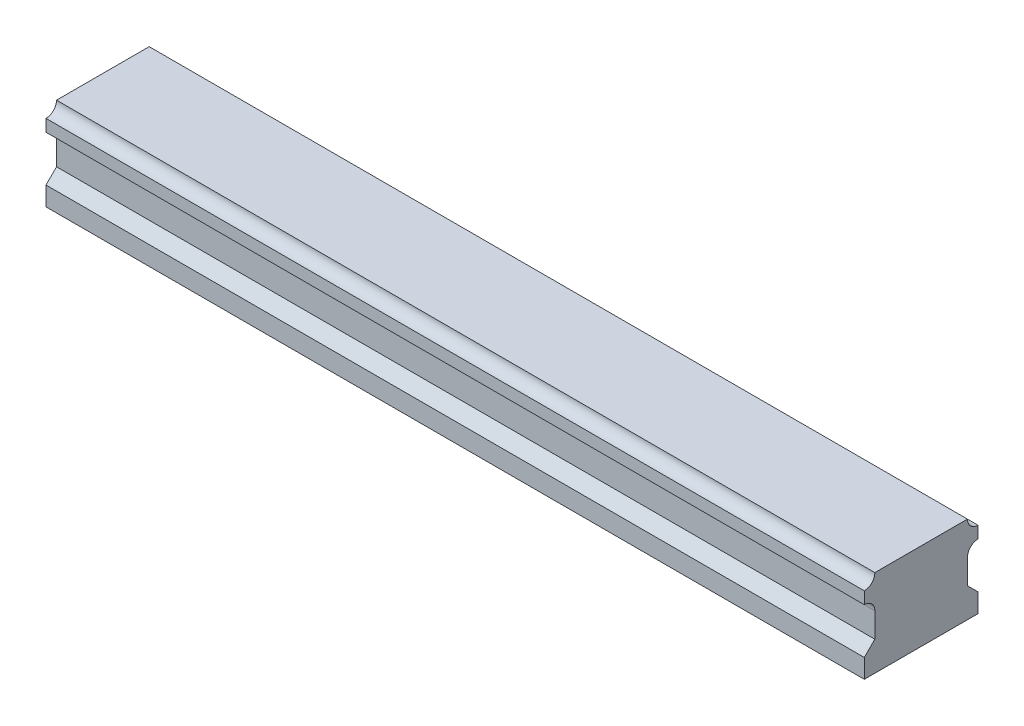
ISO-10303-21;
HEADER;
FILE_DESCRIPTION(('STEP AP214'),'2;1');
FILE_NAME('part.step','',(''),(''),'','','');
FILE_SCHEMA(('AUTOMOTIVE_DESIGN { 1 0 10303 214 1 1 1 1 }'));
ENDSEC;
DATA;
#1=APPLICATION_CONTEXT('core data for automotive mechanical design processes');
#2=APPLICATION_PROTOCOL_DEFINITION('international standard','automotive_design',2000,#1);
#3=PRODUCT_CONTEXT('',#1,'mechanical');
#4=PRODUCT('Part','Part','',(#3));
#5=PRODUCT_RELATED_PRODUCT_CATEGORY('part','',(#4));
#6=PRODUCT_DEFINITION_FORMATION('','',#4);
#7=PRODUCT_DEFINITION_CONTEXT('part definition',#1,'design');
#8=PRODUCT_DEFINITION('design','',#6,#7);
#9=PRODUCT_DEFINITION_SHAPE('','',#8);
#10=(LENGTH_UNIT() NAMED_UNIT(*) SI_UNIT(.MILLI.,.METRE.));
#11=(NAMED_UNIT(*) PLANE_ANGLE_UNIT() SI_UNIT($,.RADIAN.));
#12=(NAMED_UNIT(*) SI_UNIT($,.STERADIAN.) SOLID_ANGLE_UNIT());
#13=UNCERTAINTY_MEASURE_WITH_UNIT(LENGTH_MEASURE(1.E-05),#10,'distance_accuracy_value','');
#14=(GEOMETRIC_REPRESENTATION_CONTEXT(3) GLOBAL_UNCERTAINTY_ASSIGNED_CONTEXT((#13)) GLOBAL_UNIT_ASSIGNED_CONTEXT((#10,
#11,#12)) REPRESENTATION_CONTEXT('',''));
#15=CARTESIAN_POINT('',(0.,0.,0.));
#16=DIRECTION('',(0.,0.,1.));
#17=DIRECTION('',(1.,0.,0.));
#18=AXIS2_PLACEMENT_3D('',#15,#16,#17);
#19=CARTESIAN_POINT('',(215.9,0.,0.));
#20=DIRECTION('',(0.,0.,-1.));
#21=DIRECTION('',(-1.,0.,0.));
#22=AXIS2_PLACEMENT_3D('',#19,#20,#21);
#23=PLANE('',#22);
#24=DIRECTION('',(0.,-1.,0.));
#25=VECTOR('',#24,1.);
#26=CARTESIAN_POINT('',(0.,0.,0.));
#27=LINE('',#26,#25);
#28=CARTESIAN_POINT('',(0.,5.,0.));
#29=VERTEX_POINT('',#28);
#30=CARTESIAN_POINT('',(0.,0.,0.));
#31=VERTEX_POINT('',#30);
#32=EDGE_CURVE('E165',#29,#31,#27,.T.);
#33=ORIENTED_EDGE('',*,*,#32,.T.);
#34=DIRECTION('',(-1.,0.,0.));
#35=VECTOR('',#34,1.);
#36=CARTESIAN_POINT('',(215.9,0.,0.));
#37=LINE('',#36,#35);
#38=CARTESIAN_POINT('',(215.9,0.,0.));
#39=VERTEX_POINT('',#38);
#40=EDGE_CURVE('E11',#39,#31,#37,.T.);
#41=ORIENTED_EDGE('',*,*,#40,.F.);
#42=DIRECTION('',(0.,-1.,0.));
#43=VECTOR('',#42,1.);
#44=CARTESIAN_POINT('',(215.9,0.,0.));
#45=LINE('',#44,#43);
#46=CARTESIAN_POINT('',(215.9,5.,0.));
#47=VERTEX_POINT('',#46);
#48=EDGE_CURVE('E191',#47,#39,#45,.T.);
#49=ORIENTED_EDGE('',*,*,#48,.F.);
#50=DIRECTION('',(-1.,0.,0.));
#51=VECTOR('',#50,1.);
#52=CARTESIAN_POINT('',(215.9,5.,0.));
#53=LINE('',#52,#51);
#54=EDGE_CURVE('E161',#47,#29,#53,.T.);
#55=ORIENTED_EDGE('',*,*,#54,.T.);
#56=EDGE_LOOP('',(#33,#41,#49,#55));
#57=FACE_BOUND('',#56,.T.);
#58=ADVANCED_FACE('F33',(#57),#23,.F.);
#59=CARTESIAN_POINT('',(215.9,0.,0.));
#60=DIRECTION('',(0.,1.,0.));
#61=DIRECTION('',(0.,0.,1.));
#62=AXIS2_PLACEMENT_3D('',#59,#60,#61);
#63=PLANE('',#62);
#64=DIRECTION('',(0.,0.,-1.));
#65=VECTOR('',#64,1.);
#66=CARTESIAN_POINT('',(0.,0.,0.));
#67=LINE('',#66,#65);
#68=CARTESIAN_POINT('',(0.,0.,-30.));
#69=VERTEX_POINT('',#68);
#70=EDGE_CURVE('E168',#31,#69,#67,.T.);
#71=ORIENTED_EDGE('',*,*,#70,.T.);
#72=DIRECTION('',(-1.,0.,0.));
#73=VECTOR('',#72,1.);
#74=CARTESIAN_POINT('',(215.9,0.,-30.));
#75=LINE('',#74,#73);
#76=CARTESIAN_POINT('',(215.9,0.,-30.));
#77=VERTEX_POINT('',#76);
#78=EDGE_CURVE('E41',#77,#69,#75,.T.);
#79=ORIENTED_EDGE('',*,*,#78,.F.);
#80=DIRECTION('',(0.,0.,-1.));
#81=VECTOR('',#80,1.);
#82=CARTESIAN_POINT('',(215.9,0.,0.));
#83=LINE('',#82,#81);
#84=EDGE_CURVE('E110',#39,#77,#83,.T.);
#85=ORIENTED_EDGE('',*,*,#84,.F.);
#86=ORIENTED_EDGE('',*,*,#40,.T.);
#87=EDGE_LOOP('',(#71,#79,#85,#86));
#88=FACE_BOUND('',#87,.T.);
#89=ADVANCED_FACE('F279',(#88),#63,.F.);
#90=CARTESIAN_POINT('',(215.9,0.,-30.));
#91=DIRECTION('',(0.,0.,1.));
#92=DIRECTION('',(1.,0.,0.));
#93=AXIS2_PLACEMENT_3D('',#90,#91,#92);
#94=PLANE('',#93);
#95=DIRECTION('',(0.,1.,0.));
#96=VECTOR('',#95,1.);
#97=CARTESIAN_POINT('',(0.,0.,-30.));
#98=LINE('',#97,#96);
#99=CARTESIAN_POINT('',(0.,5.,-30.));
#100=VERTEX_POINT('',#99);
#101=EDGE_CURVE('E170',#69,#100,#98,.T.);
#102=ORIENTED_EDGE('',*,*,#101,.T.);
#103=DIRECTION('',(-1.,0.,0.));
#104=VECTOR('',#103,1.);
#105=CARTESIAN_POINT('',(215.9,5.,-30.));
#106=LINE('',#105,#104);
#107=CARTESIAN_POINT('',(215.9,5.,-30.));
#108=VERTEX_POINT('',#107);
#109=EDGE_CURVE('E216',#108,#100,#106,.T.);
#110=ORIENTED_EDGE('',*,*,#109,.F.);
#111=DIRECTION('',(0.,1.,0.));
#112=VECTOR('',#111,1.);
#113=CARTESIAN_POINT('',(215.9,0.,-30.));
#114=LINE('',#113,#112);
#115=EDGE_CURVE('E224',#77,#108,#114,.T.);
#116=ORIENTED_EDGE('',*,*,#115,.F.);
#117=ORIENTED_EDGE('',*,*,#78,.T.);
#118=EDGE_LOOP('',(#102,#110,#116,#117));
#119=FACE_BOUND('',#118,.T.);
#120=ADVANCED_FACE('F222',(#119),#94,.F.);
#121=CARTESIAN_POINT('',(215.9,5.,-30.));
#122=DIRECTION('',(0.,-0.707106781186549,0.707106781186547));
#123=DIRECTION('',(0.,-0.707106781186547,-0.707106781186549));
#124=AXIS2_PLACEMENT_3D('',#121,#122,#123);
#125=PLANE('',#124);
#126=DIRECTION('',(0.,0.707106781186546,0.707106781186548));
#127=VECTOR('',#126,1.);
#128=CARTESIAN_POINT('',(0.,5.,-30.));
#129=LINE('',#128,#127);
#130=CARTESIAN_POINT('',(0.,7.77812499999999,-27.221875));
#131=VERTEX_POINT('',#130);
#132=EDGE_CURVE('E172',#100,#131,#129,.T.);
#133=ORIENTED_EDGE('',*,*,#132,.T.);
#134=DIRECTION('',(-1.,0.,0.));
#135=VECTOR('',#134,1.);
#136=CARTESIAN_POINT('',(215.9,7.77812499999999,-27.221875));
#137=LINE('',#136,#135);
#138=CARTESIAN_POINT('',(215.9,7.77812499999999,-27.221875));
#139=VERTEX_POINT('',#138);
#140=EDGE_CURVE('E213',#139,#131,#137,.T.);
#141=ORIENTED_EDGE('',*,*,#140,.F.);
#142=DIRECTION('',(0.,0.707106781186546,0.707106781186548));
#143=VECTOR('',#142,1.);
#144=CARTESIAN_POINT('',(215.9,5.,-30.));
#145=LINE('',#144,#143);
#146=EDGE_CURVE('E242',#108,#139,#145,.T.);
#147=ORIENTED_EDGE('',*,*,#146,.F.);
#148=ORIENTED_EDGE('',*,*,#109,.T.);
#149=EDGE_LOOP('',(#133,#141,#147,#148));
#150=FACE_BOUND('',#149,.T.);
#151=ADVANCED_FACE('F233',(#150),#125,.F.);
#152=CARTESIAN_POINT('',(215.9,7.77812499999999,-27.221875));
#153=DIRECTION('',(0.,0.,1.));
#154=DIRECTION('',(0.,-1.,0.));
#155=AXIS2_PLACEMENT_3D('',#152,#153,#154);
#156=PLANE('',#155);
#157=DIRECTION('',(0.,1.,0.));
#158=VECTOR('',#157,1.);
#159=CARTESIAN_POINT('',(0.,7.77812499999999,-27.221875));
#160=LINE('',#159,#158);
#161=CARTESIAN_POINT('',(0.,14.278125,-27.221875));
#162=VERTEX_POINT('',#161);
#163=EDGE_CURVE('E174',#131,#162,#160,.T.);
#164=ORIENTED_EDGE('',*,*,#163,.T.);
#165=DIRECTION('',(-1.,0.,0.));
#166=VECTOR('',#165,1.);
#167=CARTESIAN_POINT('',(215.9,14.278125,-27.221875));
#168=LINE('',#167,#166);
#169=CARTESIAN_POINT('',(215.9,14.278125,-27.221875));
#170=VERTEX_POINT('',#169);
#171=EDGE_CURVE('E210',#170,#162,#168,.T.);
#172=ORIENTED_EDGE('',*,*,#171,.F.);
#173=DIRECTION('',(0.,1.,0.));
#174=VECTOR('',#173,1.);
#175=CARTESIAN_POINT('',(215.9,7.77812499999999,-27.221875));
#176=LINE('',#175,#174);
#177=EDGE_CURVE('E239',#139,#170,#176,.T.);
#178=ORIENTED_EDGE('',*,*,#177,.F.);
#179=ORIENTED_EDGE('',*,*,#140,.T.);
#180=EDGE_LOOP('',(#164,#172,#178,#179));
#181=FACE_BOUND('',#180,.T.);
#182=ADVANCED_FACE('F237',(#181),#156,.F.);
#183=CARTESIAN_POINT('',(215.9,14.278125,-30.));
#184=DIRECTION('',(-1.,0.,0.));
#185=DIRECTION('',(0.,0.,1.));
#186=AXIS2_PLACEMENT_3D('',#183,#184,#185);
#187=CYLINDRICAL_SURFACE('',#186,2.778125);
#188=CARTESIAN_POINT('',(0.,14.278125,-30.));
#189=DIRECTION('',(-1.,0.,0.));
#190=DIRECTION('',(0.,0.,1.));
#191=AXIS2_PLACEMENT_3D('',#188,#189,#190);
#192=CIRCLE('',#191,2.778125);
#193=CARTESIAN_POINT('',(0.,17.05625,-30.));
#194=VERTEX_POINT('',#193);
#195=EDGE_CURVE('E176',#162,#194,#192,.T.);
#196=ORIENTED_EDGE('',*,*,#195,.T.);
#197=DIRECTION('',(-1.,0.,0.));
#198=VECTOR('',#197,1.);
#199=CARTESIAN_POINT('',(215.9,17.05625,-30.));
#200=LINE('',#199,#198);
#201=CARTESIAN_POINT('',(215.9,17.05625,-30.));
#202=VERTEX_POINT('',#201);
#203=EDGE_CURVE('E207',#202,#194,#200,.T.);
#204=ORIENTED_EDGE('',*,*,#203,.F.);
#205=CARTESIAN_POINT('',(215.9,14.278125,-30.));
#206=DIRECTION('',(-1.,0.,0.));
#207=DIRECTION('',(0.,0.,1.));
#208=AXIS2_PLACEMENT_3D('',#205,#206,#207);
#209=CIRCLE('',#208,2.778125);
#210=EDGE_CURVE('E241',#170,#202,#209,.T.);
#211=ORIENTED_EDGE('',*,*,#210,.F.);
#212=ORIENTED_EDGE('',*,*,#171,.T.);
#213=EDGE_LOOP('',(#196,#204,#211,#212));
#214=FACE_BOUND('',#213,.T.);
#215=ADVANCED_FACE('F292',(#214),#187,.F.);
#216=CARTESIAN_POINT('',(215.9,20.221875,-30.));
#217=DIRECTION('',(0.,0.,1.));
#218=DIRECTION('',(1.,0.,0.));
#219=AXIS2_PLACEMENT_3D('',#216,#217,#218);
#220=PLANE('',#219);
#221=DIRECTION('',(0.,1.,0.));
#222=VECTOR('',#221,1.);
#223=CARTESIAN_POINT('',(0.,20.221875,-30.));
#224=LINE('',#223,#222);
#225=CARTESIAN_POINT('',(0.,20.221875,-30.));
#226=VERTEX_POINT('',#225);
#227=EDGE_CURVE('E178',#194,#226,#224,.T.);
#228=ORIENTED_EDGE('',*,*,#227,.T.);
#229=DIRECTION('',(-1.,0.,0.));
#230=VECTOR('',#229,1.);
#231=CARTESIAN_POINT('',(215.9,20.221875,-30.));
#232=LINE('',#231,#230);
#233=CARTESIAN_POINT('',(215.9,20.221875,-30.));
#234=VERTEX_POINT('',#233);
#235=EDGE_CURVE('E204',#234,#226,#232,.T.);
#236=ORIENTED_EDGE('',*,*,#235,.F.);
#237=DIRECTION('',(0.,1.,0.));
#238=VECTOR('',#237,1.);
#239=CARTESIAN_POINT('',(215.9,20.221875,-30.));
#240=LINE('',#239,#238);
#241=EDGE_CURVE('E244',#202,#234,#240,.T.);
#242=ORIENTED_EDGE('',*,*,#241,.F.);
#243=ORIENTED_EDGE('',*,*,#203,.T.);
#244=EDGE_LOOP('',(#228,#236,#242,#243));
#245=FACE_BOUND('',#244,.T.);
#246=ADVANCED_FACE('F295',(#245),#220,.F.);
#247=CARTESIAN_POINT('',(215.9,23.,-30.));
#248=DIRECTION('',(-1.,0.,0.));
#249=DIRECTION('',(0.,0.,1.));
#250=AXIS2_PLACEMENT_3D('',#247,#248,#249);
#251=CYLINDRICAL_SURFACE('',#250,2.778125);
#252=CARTESIAN_POINT('',(0.,23.,-30.));
#253=DIRECTION('',(-1.,0.,0.));
#254=DIRECTION('',(0.,0.,1.));
#255=AXIS2_PLACEMENT_3D('',#252,#253,#254);
#256=CIRCLE('',#255,2.778125);
#257=CARTESIAN_POINT('',(0.,23.,-27.221875));
#258=VERTEX_POINT('',#257);
#259=EDGE_CURVE('E180',#226,#258,#256,.T.);
#260=ORIENTED_EDGE('',*,*,#259,.T.);
#261=DIRECTION('',(-1.,0.,0.));
#262=VECTOR('',#261,1.);
#263=CARTESIAN_POINT('',(215.9,23.,-27.221875));
#264=LINE('',#263,#262);
#265=CARTESIAN_POINT('',(215.9,23.,-27.221875));
#266=VERTEX_POINT('',#265);
#267=EDGE_CURVE('E201',#266,#258,#264,.T.);
#268=ORIENTED_EDGE('',*,*,#267,.F.);
#269=CARTESIAN_POINT('',(215.9,23.,-30.));
#270=DIRECTION('',(-1.,0.,0.));
#271=DIRECTION('',(0.,0.,1.));
#272=AXIS2_PLACEMENT_3D('',#269,#270,#271);
#273=CIRCLE('',#272,2.778125);
#274=EDGE_CURVE('E250',#234,#266,#273,.T.);
#275=ORIENTED_EDGE('',*,*,#274,.F.);
#276=ORIENTED_EDGE('',*,*,#235,.T.);
#277=EDGE_LOOP('',(#260,#268,#275,#276));
#278=FACE_BOUND('',#277,.T.);
#279=ADVANCED_FACE('F299',(#278),#251,.F.);
#280=CARTESIAN_POINT('',(215.9,23.,-27.221875));
#281=DIRECTION('',(0.,-1.,0.));
#282=DIRECTION('',(0.,0.,-1.));
#283=AXIS2_PLACEMENT_3D('',#280,#281,#282);
#284=PLANE('',#283);
#285=DIRECTION('',(0.,0.,1.));
#286=VECTOR('',#285,1.);
#287=CARTESIAN_POINT('',(0.,23.,-27.221875));
#288=LINE('',#287,#286);
#289=CARTESIAN_POINT('',(0.,23.,-2.778125));
#290=VERTEX_POINT('',#289);
#291=EDGE_CURVE('E182',#258,#290,#288,.T.);
#292=ORIENTED_EDGE('',*,*,#291,.T.);
#293=DIRECTION('',(-1.,0.,0.));
#294=VECTOR('',#293,1.);
#295=CARTESIAN_POINT('',(215.9,23.,-2.778125));
#296=LINE('',#295,#294);
#297=CARTESIAN_POINT('',(215.9,23.,-2.778125));
#298=VERTEX_POINT('',#297);
#299=EDGE_CURVE('E198',#298,#290,#296,.T.);
#300=ORIENTED_EDGE('',*,*,#299,.F.);
#301=DIRECTION('',(0.,0.,1.));
#302=VECTOR('',#301,1.);
#303=CARTESIAN_POINT('',(215.9,23.,-27.221875));
#304=LINE('',#303,#302);
#305=EDGE_CURVE('E252',#266,#298,#304,.T.);
#306=ORIENTED_EDGE('',*,*,#305,.F.);
#307=ORIENTED_EDGE('',*,*,#267,.T.);
#308=EDGE_LOOP('',(#292,#300,#306,#307));
#309=FACE_BOUND('',#308,.T.);
#310=ADVANCED_FACE('F303',(#309),#284,.F.);
#311=CARTESIAN_POINT('',(215.9,23.,0.));
#312=DIRECTION('',(-1.,0.,0.));
#313=DIRECTION('',(0.,0.,1.));
#314=AXIS2_PLACEMENT_3D('',#311,#312,#313);
#315=CYLINDRICAL_SURFACE('',#314,2.778125);
#316=CARTESIAN_POINT('',(0.,23.,0.));
#317=DIRECTION('',(-1.,0.,0.));
#318=DIRECTION('',(0.,0.,-1.));
#319=AXIS2_PLACEMENT_3D('',#316,#317,#318);
#320=CIRCLE('',#319,2.778125);
#321=CARTESIAN_POINT('',(0.,20.221875,0.));
#322=VERTEX_POINT('',#321);
#323=EDGE_CURVE('E184',#290,#322,#320,.T.);
#324=ORIENTED_EDGE('',*,*,#323,.T.);
#325=DIRECTION('',(-1.,0.,0.));
#326=VECTOR('',#325,1.);
#327=CARTESIAN_POINT('',(215.9,20.221875,0.));
#328=LINE('',#327,#326);
#329=CARTESIAN_POINT('',(215.9,20.221875,0.));
#330=VERTEX_POINT('',#329);
#331=EDGE_CURVE('E195',#330,#322,#328,.T.);
#332=ORIENTED_EDGE('',*,*,#331,.F.);
#333=CARTESIAN_POINT('',(215.9,23.,0.));
#334=DIRECTION('',(-1.,0.,0.));
#335=DIRECTION('',(0.,0.,-1.));
#336=AXIS2_PLACEMENT_3D('',#333,#334,#335);
#337=CIRCLE('',#336,2.778125);
#338=EDGE_CURVE('E254',#298,#330,#337,.T.);
#339=ORIENTED_EDGE('',*,*,#338,.F.);
#340=ORIENTED_EDGE('',*,*,#299,.T.);
#341=EDGE_LOOP('',(#324,#332,#339,#340));
#342=FACE_BOUND('',#341,.T.);
#343=ADVANCED_FACE('F260',(#342),#315,.F.);
#344=CARTESIAN_POINT('',(215.9,20.221875,0.));
#345=DIRECTION('',(0.,0.,-1.));
#346=DIRECTION('',(0.,1.,0.));
#347=AXIS2_PLACEMENT_3D('',#344,#345,#346);
#348=PLANE('',#347);
#349=DIRECTION('',(0.,-1.,0.));
#350=VECTOR('',#349,1.);
#351=CARTESIAN_POINT('',(0.,20.221875,0.));
#352=LINE('',#351,#350);
#353=CARTESIAN_POINT('',(0.,17.05625,0.));
#354=VERTEX_POINT('',#353);
#355=EDGE_CURVE('E186',#322,#354,#352,.T.);
#356=ORIENTED_EDGE('',*,*,#355,.T.);
#357=DIRECTION('',(-1.,0.,0.));
#358=VECTOR('',#357,1.);
#359=CARTESIAN_POINT('',(215.9,17.05625,0.));
#360=LINE('',#359,#358);
#361=CARTESIAN_POINT('',(215.9,17.05625,0.));
#362=VERTEX_POINT('',#361);
#363=EDGE_CURVE('E156',#362,#354,#360,.T.);
#364=ORIENTED_EDGE('',*,*,#363,.F.);
#365=DIRECTION('',(0.,-1.,0.));
#366=VECTOR('',#365,1.);
#367=CARTESIAN_POINT('',(215.9,20.221875,0.));
#368=LINE('',#367,#366);
#369=EDGE_CURVE('E147',#330,#362,#368,.T.);
#370=ORIENTED_EDGE('',*,*,#369,.F.);
#371=ORIENTED_EDGE('',*,*,#331,.T.);
#372=EDGE_LOOP('',(#356,#364,#370,#371));
#373=FACE_BOUND('',#372,.T.);
#374=ADVANCED_FACE('F264',(#373),#348,.F.);
#375=CARTESIAN_POINT('',(215.9,14.278125,0.));
#376=DIRECTION('',(-1.,0.,0.));
#377=DIRECTION('',(0.,0.,1.));
#378=AXIS2_PLACEMENT_3D('',#375,#376,#377);
#379=CYLINDRICAL_SURFACE('',#378,2.778125);
#380=CARTESIAN_POINT('',(0.,14.278125,0.));
#381=DIRECTION('',(-1.,0.,0.));
#382=DIRECTION('',(0.,0.,-1.));
#383=AXIS2_PLACEMENT_3D('',#380,#381,#382);
#384=CIRCLE('',#383,2.778125);
#385=CARTESIAN_POINT('',(0.,14.278125,-2.778125));
#386=VERTEX_POINT('',#385);
#387=EDGE_CURVE('E155',#354,#386,#384,.T.);
#388=ORIENTED_EDGE('',*,*,#387,.T.);
#389=DIRECTION('',(-1.,0.,0.));
#390=VECTOR('',#389,1.);
#391=CARTESIAN_POINT('',(215.9,14.278125,-2.778125));
#392=LINE('',#391,#390);
#393=CARTESIAN_POINT('',(215.9,14.278125,-2.778125));
#394=VERTEX_POINT('',#393);
#395=EDGE_CURVE('E152',#394,#386,#392,.T.);
#396=ORIENTED_EDGE('',*,*,#395,.F.);
#397=CARTESIAN_POINT('',(215.9,14.278125,0.));
#398=DIRECTION('',(-1.,0.,0.));
#399=DIRECTION('',(0.,0.,-1.));
#400=AXIS2_PLACEMENT_3D('',#397,#398,#399);
#401=CIRCLE('',#400,2.778125);
#402=EDGE_CURVE('E141',#362,#394,#401,.T.);
#403=ORIENTED_EDGE('',*,*,#402,.F.);
#404=ORIENTED_EDGE('',*,*,#363,.T.);
#405=EDGE_LOOP('',(#388,#396,#403,#404));
#406=FACE_BOUND('',#405,.T.);
#407=ADVANCED_FACE('F153',(#406),#379,.F.);
#408=CARTESIAN_POINT('',(215.9,7.77812499999999,-2.778125));
#409=DIRECTION('',(0.,0.,-1.));
#410=DIRECTION('',(0.,1.,0.));
#411=AXIS2_PLACEMENT_3D('',#408,#409,#410);
#412=PLANE('',#411);
#413=DIRECTION('',(0.,-1.,0.));
#414=VECTOR('',#413,1.);
#415=CARTESIAN_POINT('',(0.,7.77812499999999,-2.778125));
#416=LINE('',#415,#414);
#417=CARTESIAN_POINT('',(0.,7.77812499999999,-2.778125));
#418=VERTEX_POINT('',#417);
#419=EDGE_CURVE('E96',#386,#418,#416,.T.);
#420=ORIENTED_EDGE('',*,*,#419,.T.);
#421=DIRECTION('',(-1.,0.,0.));
#422=VECTOR('',#421,1.);
#423=CARTESIAN_POINT('',(215.9,7.77812499999999,-2.778125));
#424=LINE('',#423,#422);
#425=CARTESIAN_POINT('',(215.9,7.77812499999999,-2.778125));
#426=VERTEX_POINT('',#425);
#427=EDGE_CURVE('E157',#426,#418,#424,.T.);
#428=ORIENTED_EDGE('',*,*,#427,.F.);
#429=DIRECTION('',(0.,-1.,0.));
#430=VECTOR('',#429,1.);
#431=CARTESIAN_POINT('',(215.9,7.77812499999999,-2.778125));
#432=LINE('',#431,#430);
#433=EDGE_CURVE('E145',#394,#426,#432,.T.);
#434=ORIENTED_EDGE('',*,*,#433,.F.);
#435=ORIENTED_EDGE('',*,*,#395,.T.);
#436=EDGE_LOOP('',(#420,#428,#434,#435));
#437=FACE_BOUND('',#436,.T.);
#438=ADVANCED_FACE('F159',(#437),#412,.F.);
#439=CARTESIAN_POINT('',(215.9,5.,0.));
#440=DIRECTION('',(0.,-0.707106781186549,-0.707106781186546));
#441=DIRECTION('',(0.,0.707106781186546,-0.707106781186549));
#442=AXIS2_PLACEMENT_3D('',#439,#440,#441);
#443=PLANE('',#442);
#444=DIRECTION('',(0.,-0.707106781186546,0.707106781186549));
#445=VECTOR('',#444,1.);
#446=CARTESIAN_POINT('',(0.,5.,0.));
#447=LINE('',#446,#445);
#448=EDGE_CURVE('E102',#418,#29,#447,.T.);
#449=ORIENTED_EDGE('',*,*,#448,.T.);
#450=ORIENTED_EDGE('',*,*,#54,.F.);
#451=DIRECTION('',(0.,-0.707106781186546,0.707106781186549));
#452=VECTOR('',#451,1.);
#453=CARTESIAN_POINT('',(215.9,5.,0.));
#454=LINE('',#453,#452);
#455=EDGE_CURVE('E49',#426,#47,#454,.T.);
#456=ORIENTED_EDGE('',*,*,#455,.F.);
#457=ORIENTED_EDGE('',*,*,#427,.T.);
#458=EDGE_LOOP('',(#449,#450,#456,#457));
#459=FACE_BOUND('',#458,.T.);
#460=ADVANCED_FACE('F268',(#459),#443,.F.);
#461=CARTESIAN_POINT('',(215.9,14.278125,0.));
#462=DIRECTION('',(1.,0.,0.));
#463=DIRECTION('',(0.,0.,-1.));
#464=AXIS2_PLACEMENT_3D('',#461,#462,#463);
#465=PLANE('',#464);
#466=ORIENTED_EDGE('',*,*,#48,.T.);
#467=ORIENTED_EDGE('',*,*,#84,.T.);
#468=ORIENTED_EDGE('',*,*,#115,.T.);
#469=ORIENTED_EDGE('',*,*,#146,.T.);
#470=ORIENTED_EDGE('',*,*,#177,.T.);
#471=ORIENTED_EDGE('',*,*,#210,.T.);
#472=ORIENTED_EDGE('',*,*,#241,.T.);
#473=ORIENTED_EDGE('',*,*,#274,.T.);
#474=ORIENTED_EDGE('',*,*,#305,.T.);
#475=ORIENTED_EDGE('',*,*,#338,.T.);
#476=ORIENTED_EDGE('',*,*,#369,.T.);
#477=ORIENTED_EDGE('',*,*,#402,.T.);
#478=ORIENTED_EDGE('',*,*,#433,.T.);
#479=ORIENTED_EDGE('',*,*,#455,.T.);
#480=EDGE_LOOP('',(#466,#467,#468,#469,#470,#471,#472,#473,#474,#475,#476,#477,#478,#479));
#481=FACE_BOUND('',#480,.T.);
#482=ADVANCED_FACE('F143',(#481),#465,.T.);
#483=CARTESIAN_POINT('',(0.,14.278125,0.));
#484=DIRECTION('',(1.,0.,0.));
#485=DIRECTION('',(0.,0.,-1.));
#486=AXIS2_PLACEMENT_3D('',#483,#484,#485);
#487=PLANE('',#486);
#488=ORIENTED_EDGE('',*,*,#32,.F.);
#489=ORIENTED_EDGE('',*,*,#448,.F.);
#490=ORIENTED_EDGE('',*,*,#419,.F.);
#491=ORIENTED_EDGE('',*,*,#387,.F.);
#492=ORIENTED_EDGE('',*,*,#355,.F.);
#493=ORIENTED_EDGE('',*,*,#323,.F.);
#494=ORIENTED_EDGE('',*,*,#291,.F.);
#495=ORIENTED_EDGE('',*,*,#259,.F.);
#496=ORIENTED_EDGE('',*,*,#227,.F.);
#497=ORIENTED_EDGE('',*,*,#195,.F.);
#498=ORIENTED_EDGE('',*,*,#163,.F.);
#499=ORIENTED_EDGE('',*,*,#132,.F.);
#500=ORIENTED_EDGE('',*,*,#101,.F.);
#501=ORIENTED_EDGE('',*,*,#70,.F.);
#502=EDGE_LOOP('',(#488,#489,#490,#491,#492,#493,#494,#495,#496,#497,#498,#499,#500,#501));
#503=FACE_BOUND('',#502,.T.);
#504=ADVANCED_FACE('F228',(#503),#487,.F.);
#505=CLOSED_SHELL('',(#58,#89,#120,#151,#182,#215,#246,#279,#310,#343,#374,#407,#438,#460,#482,#504));
#506=MANIFOLD_SOLID_BREP('B2',#505);
#507=ADVANCED_BREP_SHAPE_REPRESENTATION('',(#18,#506),#14);
#508=SHAPE_DEFINITION_REPRESENTATION(#9,#507);
ENDSEC;
END-ISO-10303-21;
